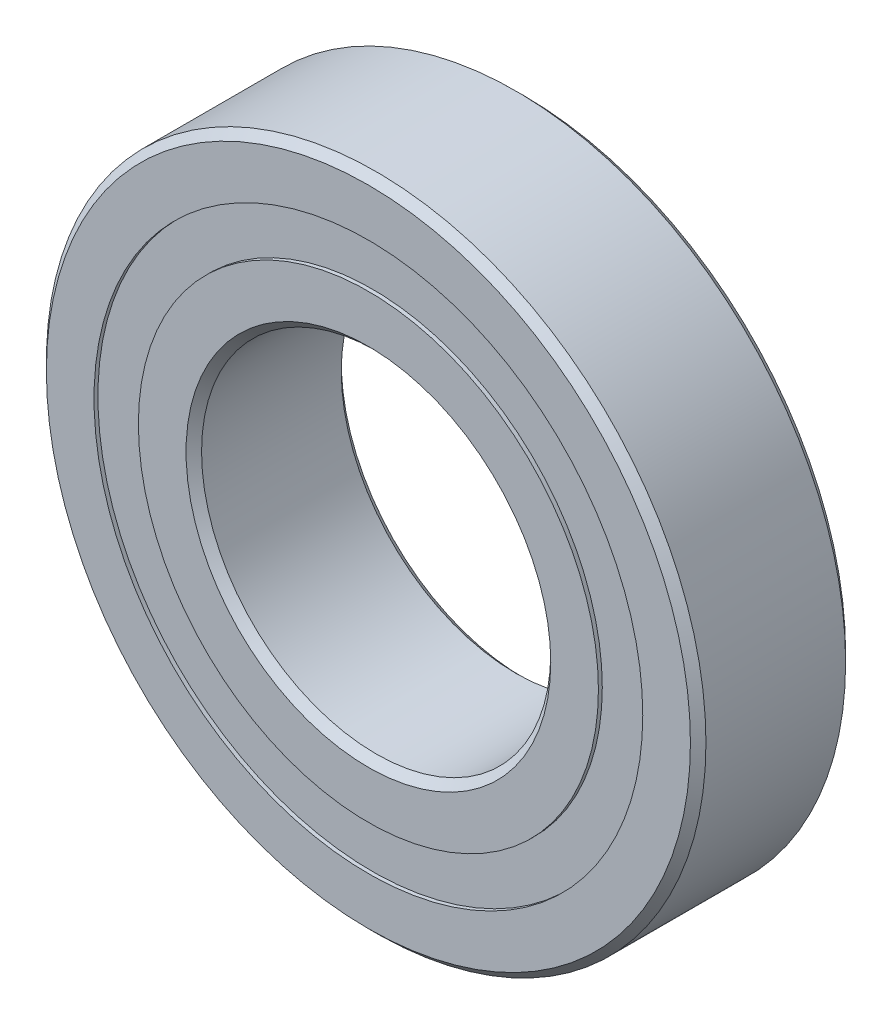
ISO-10303-21;
HEADER;
FILE_DESCRIPTION(('STEP AP214'),'2;1');
FILE_NAME('part.step','',(''),(''),'','','');
FILE_SCHEMA(('AUTOMOTIVE_DESIGN { 1 0 10303 214 1 1 1 1 }'));
ENDSEC;
DATA;
#1=APPLICATION_CONTEXT('core data for automotive mechanical design processes');
#2=APPLICATION_PROTOCOL_DEFINITION('international standard','automotive_design',2000,#1);
#3=PRODUCT_CONTEXT('',#1,'mechanical');
#4=PRODUCT('Part','Part','',(#3));
#5=PRODUCT_RELATED_PRODUCT_CATEGORY('part','',(#4));
#6=PRODUCT_DEFINITION_FORMATION('','',#4);
#7=PRODUCT_DEFINITION_CONTEXT('part definition',#1,'design');
#8=PRODUCT_DEFINITION('design','',#6,#7);
#9=PRODUCT_DEFINITION_SHAPE('','',#8);
#10=(LENGTH_UNIT() NAMED_UNIT(*) SI_UNIT(.MILLI.,.METRE.));
#11=(NAMED_UNIT(*) PLANE_ANGLE_UNIT() SI_UNIT($,.RADIAN.));
#12=(NAMED_UNIT(*) SI_UNIT($,.STERADIAN.) SOLID_ANGLE_UNIT());
#13=UNCERTAINTY_MEASURE_WITH_UNIT(LENGTH_MEASURE(1.E-05),#10,'distance_accuracy_value','');
#14=(GEOMETRIC_REPRESENTATION_CONTEXT(3) GLOBAL_UNCERTAINTY_ASSIGNED_CONTEXT((#13)) GLOBAL_UNIT_ASSIGNED_CONTEXT((#10,
#11,#12)) REPRESENTATION_CONTEXT('',''));
#15=CARTESIAN_POINT('',(0.,0.,0.));
#16=DIRECTION('',(0.,0.,1.));
#17=DIRECTION('',(1.,0.,0.));
#18=AXIS2_PLACEMENT_3D('',#15,#16,#17);
#19=CARTESIAN_POINT('',(0.,22.4517857142857,-6.0325));
#20=DIRECTION('',(0.,0.,1.));
#21=DIRECTION('',(1.,0.,0.));
#22=AXIS2_PLACEMENT_3D('',#19,#20,#21);
#23=PLANE('',#22);
#24=CARTESIAN_POINT('',(0.,0.,-6.0325));
#25=DIRECTION('',(0.,0.,1.));
#26=DIRECTION('',(1.,0.,0.));
#27=AXIS2_PLACEMENT_3D('',#24,#25,#26);
#28=CIRCLE('',#27,22.4517857142857);
#29=CARTESIAN_POINT('',(22.4517857142857,0.,-6.0325));
#30=VERTEX_POINT('',#29);
#31=EDGE_CURVE('E57',#30,#30,#28,.T.);
#32=ORIENTED_EDGE('',*,*,#31,.F.);
#33=EDGE_LOOP('',(#32));
#34=FACE_BOUND('',#33,.T.);
#35=CARTESIAN_POINT('',(0.,0.,-6.03250000000001));
#36=DIRECTION('',(0.,0.,1.));
#37=DIRECTION('',(1.,0.,0.));
#38=AXIS2_PLACEMENT_3D('',#35,#36,#37);
#39=CIRCLE('',#38,18.8232142857143);
#40=CARTESIAN_POINT('',(18.8232142857143,0.,-6.03250000000001));
#41=VERTEX_POINT('',#40);
#42=EDGE_CURVE('E11',#41,#41,#39,.T.);
#43=ORIENTED_EDGE('',*,*,#42,.T.);
#44=EDGE_LOOP('',(#43));
#45=FACE_BOUND('',#44,.T.);
#46=ADVANCED_FACE('F43',(#34,#45),#23,.F.);
#47=CARTESIAN_POINT('',(0.,0.,6.35));
#48=DIRECTION('',(0.,0.,1.));
#49=DIRECTION('',(1.,0.,0.));
#50=AXIS2_PLACEMENT_3D('',#47,#48,#49);
#51=CYLINDRICAL_SURFACE('',#50,18.8232142857143);
#52=ORIENTED_EDGE('',*,*,#42,.F.);
#53=EDGE_LOOP('',(#52));
#54=FACE_BOUND('',#53,.T.);
#55=CARTESIAN_POINT('',(0.,0.,-3.35508135887435));
#56=DIRECTION('',(0.,0.,1.));
#57=DIRECTION('',(1.,0.,0.));
#58=AXIS2_PLACEMENT_3D('',#55,#56,#57);
#59=CIRCLE('',#58,18.8232142857143);
#60=CARTESIAN_POINT('',(18.8232142857143,0.,-3.35508135887435));
#61=VERTEX_POINT('',#60);
#62=EDGE_CURVE('E49',#61,#61,#59,.T.);
#63=ORIENTED_EDGE('',*,*,#62,.T.);
#64=EDGE_LOOP('',(#63));
#65=FACE_BOUND('',#64,.T.);
#66=ADVANCED_FACE('F66',(#54,#65),#51,.F.);
#67=CARTESIAN_POINT('',(0.,22.4517857142857,-3.35508135887435));
#68=DIRECTION('',(0.,0.,-1.));
#69=DIRECTION('',(-1.,0.,0.));
#70=AXIS2_PLACEMENT_3D('',#67,#68,#69);
#71=PLANE('',#70);
#72=ORIENTED_EDGE('',*,*,#62,.F.);
#73=EDGE_LOOP('',(#72));
#74=FACE_BOUND('',#73,.T.);
#75=CARTESIAN_POINT('',(0.,0.,-3.35508135887435));
#76=DIRECTION('',(0.,0.,1.));
#77=DIRECTION('',(1.,0.,0.));
#78=AXIS2_PLACEMENT_3D('',#75,#76,#77);
#79=CIRCLE('',#78,22.4517857142857);
#80=CARTESIAN_POINT('',(22.4517857142857,0.,-3.35508135887435));
#81=VERTEX_POINT('',#80);
#82=EDGE_CURVE('E53',#81,#81,#79,.T.);
#83=ORIENTED_EDGE('',*,*,#82,.T.);
#84=EDGE_LOOP('',(#83));
#85=FACE_BOUND('',#84,.T.);
#86=ADVANCED_FACE('F70',(#74,#85),#71,.F.);
#87=CARTESIAN_POINT('',(0.,0.,6.35));
#88=DIRECTION('',(0.,0.,1.));
#89=DIRECTION('',(1.,0.,0.));
#90=AXIS2_PLACEMENT_3D('',#87,#88,#89);
#91=CYLINDRICAL_SURFACE('',#90,22.4517857142857);
#92=ORIENTED_EDGE('',*,*,#82,.F.);
#93=EDGE_LOOP('',(#92));
#94=FACE_BOUND('',#93,.T.);
#95=ORIENTED_EDGE('',*,*,#31,.T.);
#96=EDGE_LOOP('',(#95));
#97=FACE_BOUND('',#96,.T.);
#98=ADVANCED_FACE('F63',(#94,#97),#91,.T.);
#99=CLOSED_SHELL('',(#46,#66,#86,#98));
#100=MANIFOLD_SOLID_BREP('B2',#99);
#101=CARTESIAN_POINT('',(0.,22.4517857142857,6.0325));
#102=DIRECTION('',(0.,0.,-1.));
#103=DIRECTION('',(-1.,0.,0.));
#104=AXIS2_PLACEMENT_3D('',#101,#102,#103);
#105=PLANE('',#104);
#106=CARTESIAN_POINT('',(0.,0.,6.0325));
#107=DIRECTION('',(0.,0.,1.));
#108=DIRECTION('',(1.,0.,0.));
#109=AXIS2_PLACEMENT_3D('',#106,#107,#108);
#110=CIRCLE('',#109,18.8232142857143);
#111=CARTESIAN_POINT('',(18.8232142857143,0.,6.0325));
#112=VERTEX_POINT('',#111);
#113=EDGE_CURVE('E42',#112,#112,#110,.T.);
#114=ORIENTED_EDGE('',*,*,#113,.F.);
#115=EDGE_LOOP('',(#114));
#116=FACE_BOUND('',#115,.T.);
#117=CARTESIAN_POINT('',(0.,0.,6.0325));
#118=DIRECTION('',(0.,0.,1.));
#119=DIRECTION('',(1.,0.,0.));
#120=AXIS2_PLACEMENT_3D('',#117,#118,#119);
#121=CIRCLE('',#120,22.4517857142857);
#122=CARTESIAN_POINT('',(22.4517857142857,0.,6.0325));
#123=VERTEX_POINT('',#122);
#124=EDGE_CURVE('E124',#123,#123,#121,.T.);
#125=ORIENTED_EDGE('',*,*,#124,.T.);
#126=EDGE_LOOP('',(#125));
#127=FACE_BOUND('',#126,.T.);
#128=ADVANCED_FACE('F110',(#116,#127),#105,.F.);
#129=CARTESIAN_POINT('',(0.,0.,6.35));
#130=DIRECTION('',(0.,0.,1.));
#131=DIRECTION('',(1.,0.,0.));
#132=AXIS2_PLACEMENT_3D('',#129,#130,#131);
#133=CYLINDRICAL_SURFACE('',#132,18.8232142857143);
#134=CARTESIAN_POINT('',(0.,0.,3.35508135887435));
#135=DIRECTION('',(0.,0.,1.));
#136=DIRECTION('',(1.,0.,0.));
#137=AXIS2_PLACEMENT_3D('',#134,#135,#136);
#138=CIRCLE('',#137,18.8232142857143);
#139=CARTESIAN_POINT('',(18.8232142857143,0.,3.35508135887435));
#140=VERTEX_POINT('',#139);
#141=EDGE_CURVE('E116',#140,#140,#138,.T.);
#142=ORIENTED_EDGE('',*,*,#141,.F.);
#143=EDGE_LOOP('',(#142));
#144=FACE_BOUND('',#143,.T.);
#145=ORIENTED_EDGE('',*,*,#113,.T.);
#146=EDGE_LOOP('',(#145));
#147=FACE_BOUND('',#146,.T.);
#148=ADVANCED_FACE('F139',(#144,#147),#133,.F.);
#149=CARTESIAN_POINT('',(0.,22.4517857142857,3.35508135887435));
#150=DIRECTION('',(0.,0.,1.));
#151=DIRECTION('',(1.,0.,0.));
#152=AXIS2_PLACEMENT_3D('',#149,#150,#151);
#153=PLANE('',#152);
#154=CARTESIAN_POINT('',(0.,0.,3.35508135887435));
#155=DIRECTION('',(0.,0.,1.));
#156=DIRECTION('',(1.,0.,0.));
#157=AXIS2_PLACEMENT_3D('',#154,#155,#156);
#158=CIRCLE('',#157,22.4517857142857);
#159=CARTESIAN_POINT('',(22.4517857142857,0.,3.35508135887435));
#160=VERTEX_POINT('',#159);
#161=EDGE_CURVE('E120',#160,#160,#158,.T.);
#162=ORIENTED_EDGE('',*,*,#161,.F.);
#163=EDGE_LOOP('',(#162));
#164=FACE_BOUND('',#163,.T.);
#165=ORIENTED_EDGE('',*,*,#141,.T.);
#166=EDGE_LOOP('',(#165));
#167=FACE_BOUND('',#166,.T.);
#168=ADVANCED_FACE('F134',(#164,#167),#153,.F.);
#169=CARTESIAN_POINT('',(0.,0.,6.35));
#170=DIRECTION('',(0.,0.,1.));
#171=DIRECTION('',(1.,0.,0.));
#172=AXIS2_PLACEMENT_3D('',#169,#170,#171);
#173=CYLINDRICAL_SURFACE('',#172,22.4517857142857);
#174=ORIENTED_EDGE('',*,*,#124,.F.);
#175=EDGE_LOOP('',(#174));
#176=FACE_BOUND('',#175,.T.);
#177=ORIENTED_EDGE('',*,*,#161,.T.);
#178=EDGE_LOOP('',(#177));
#179=FACE_BOUND('',#178,.T.);
#180=ADVANCED_FACE('F131',(#176,#179),#173,.T.);
#181=CLOSED_SHELL('',(#128,#148,#168,#180));
#182=MANIFOLD_SOLID_BREP('B6',#181);
#183=CARTESIAN_POINT('',(-10.3187499999998,17.8725992706015,0.));
#184=DIRECTION('',(0.,0.,1.));
#185=DIRECTION('',(-0.499999999999989,0.866025403784445,0.));
#186=AXIS2_PLACEMENT_3D('',#183,#184,#185);
#187=SPHERICAL_SURFACE('',#186,3.35508135887435);
#188=CARTESIAN_POINT('',(-10.3187499999998,17.8725992706015,3.35508135887435));
#189=VERTEX_POINT('',#188);
#190=VERTEX_LOOP('',#189);
#191=FACE_BOUND('',#190,.T.);
#192=ADVANCED_FACE('F177',(#191),#187,.T.);
#193=CLOSED_SHELL('',(#192));
#194=MANIFOLD_SOLID_BREP('B37',#193);
#195=CARTESIAN_POINT('',(-17.8725992706012,10.3187500000002,0.));
#196=DIRECTION('',(0.,0.,1.));
#197=DIRECTION('',(-0.866025403784433,0.50000000000001,0.));
#198=AXIS2_PLACEMENT_3D('',#195,#196,#197);
#199=SPHERICAL_SURFACE('',#198,3.35508135887435);
#200=CARTESIAN_POINT('',(-17.8725992706012,10.3187500000002,3.35508135887435));
#201=VERTEX_POINT('',#200);
#202=VERTEX_LOOP('',#201);
#203=FACE_BOUND('',#202,.T.);
#204=ADVANCED_FACE('F197',(#203),#199,.T.);
#205=CLOSED_SHELL('',(#204));
#206=MANIFOLD_SOLID_BREP('B106',#205);
#207=CARTESIAN_POINT('',(-20.6375,2.16166338391125E-13,0.));
#208=DIRECTION('',(0.,0.,1.));
#209=DIRECTION('',(-1.,0.,0.));
#210=AXIS2_PLACEMENT_3D('',#207,#208,#209);
#211=SPHERICAL_SURFACE('',#210,3.35508135887435);
#212=CARTESIAN_POINT('',(-20.6375,2.16166338391125E-13,3.35508135887435));
#213=VERTEX_POINT('',#212);
#214=VERTEX_LOOP('',#213);
#215=FACE_BOUND('',#214,.T.);
#216=ADVANCED_FACE('F217',(#215),#211,.T.);
#217=CLOSED_SHELL('',(#216));
#218=MANIFOLD_SOLID_BREP('B173',#217);
#219=CARTESIAN_POINT('',(-17.8725992706014,-10.3187499999998,0.));
#220=DIRECTION('',(0.,0.,1.));
#221=DIRECTION('',(-0.866025403784443,-0.499999999999992,0.));
#222=AXIS2_PLACEMENT_3D('',#219,#220,#221);
#223=SPHERICAL_SURFACE('',#222,3.35508135887435);
#224=CARTESIAN_POINT('',(-17.8725992706014,-10.3187499999998,3.35508135887435));
#225=VERTEX_POINT('',#224);
#226=VERTEX_LOOP('',#225);
#227=FACE_BOUND('',#226,.T.);
#228=ADVANCED_FACE('F237',(#227),#223,.T.);
#229=CLOSED_SHELL('',(#228));
#230=MANIFOLD_SOLID_BREP('B193',#229);
#231=CARTESIAN_POINT('',(-10.3187500000001,-17.8725992706013,0.));
#232=DIRECTION('',(0.,0.,1.));
#233=DIRECTION('',(-0.500000000000007,-0.866025403784435,0.));
#234=AXIS2_PLACEMENT_3D('',#231,#232,#233);
#235=SPHERICAL_SURFACE('',#234,3.35508135887435);
#236=CARTESIAN_POINT('',(-10.3187500000001,-17.8725992706013,3.35508135887435));
#237=VERTEX_POINT('',#236);
#238=VERTEX_LOOP('',#237);
#239=FACE_BOUND('',#238,.T.);
#240=ADVANCED_FACE('F257',(#239),#235,.T.);
#241=CLOSED_SHELL('',(#240));
#242=MANIFOLD_SOLID_BREP('B213',#241);
#243=CARTESIAN_POINT('',(-1.4411089226075E-13,-20.6375,0.));
#244=DIRECTION('',(0.,0.,1.));
#245=DIRECTION('',(0.,-1.,0.));
#246=AXIS2_PLACEMENT_3D('',#243,#244,#245);
#247=SPHERICAL_SURFACE('',#246,3.35508135887435);
#248=CARTESIAN_POINT('',(-1.4411089226075E-13,-20.6375,3.35508135887435));
#249=VERTEX_POINT('',#248);
#250=VERTEX_LOOP('',#249);
#251=FACE_BOUND('',#250,.T.);
#252=ADVANCED_FACE('F277',(#251),#247,.T.);
#253=CLOSED_SHELL('',(#252));
#254=MANIFOLD_SOLID_BREP('B233',#253);
#255=CARTESIAN_POINT('',(10.3187499999999,-17.8725992706014,0.));
#256=DIRECTION('',(0.,0.,1.));
#257=DIRECTION('',(0.499999999999995,-0.866025403784442,0.));
#258=AXIS2_PLACEMENT_3D('',#255,#256,#257);
#259=SPHERICAL_SURFACE('',#258,3.35508135887435);
#260=CARTESIAN_POINT('',(10.3187499999999,-17.8725992706014,3.35508135887435));
#261=VERTEX_POINT('',#260);
#262=VERTEX_LOOP('',#261);
#263=FACE_BOUND('',#262,.T.);
#264=ADVANCED_FACE('F297',(#263),#259,.T.);
#265=CLOSED_SHELL('',(#264));
#266=MANIFOLD_SOLID_BREP('B253',#265);
#267=CARTESIAN_POINT('',(17.8725992706013,-10.3187500000001,0.));
#268=DIRECTION('',(0.,0.,1.));
#269=DIRECTION('',(0.866025403784436,-0.500000000000004,0.));
#270=AXIS2_PLACEMENT_3D('',#267,#268,#269);
#271=SPHERICAL_SURFACE('',#270,3.35508135887435);
#272=CARTESIAN_POINT('',(17.8725992706013,-10.3187500000001,3.35508135887435));
#273=VERTEX_POINT('',#272);
#274=VERTEX_LOOP('',#273);
#275=FACE_BOUND('',#274,.T.);
#276=ADVANCED_FACE('F317',(#275),#271,.T.);
#277=CLOSED_SHELL('',(#276));
#278=MANIFOLD_SOLID_BREP('B273',#277);
#279=CARTESIAN_POINT('',(20.6375,0.,0.));
#280=DIRECTION('',(0.,0.,1.));
#281=DIRECTION('',(1.,0.,0.));
#282=AXIS2_PLACEMENT_3D('',#279,#280,#281);
#283=SPHERICAL_SURFACE('',#282,3.35508135887435);
#284=CARTESIAN_POINT('',(20.6375,0.,3.35508135887435));
#285=VERTEX_POINT('',#284);
#286=VERTEX_LOOP('',#285);
#287=FACE_BOUND('',#286,.T.);
#288=ADVANCED_FACE('F337',(#287),#283,.T.);
#289=CLOSED_SHELL('',(#288));
#290=MANIFOLD_SOLID_BREP('B293',#289);
#291=CARTESIAN_POINT('',(17.8725992706014,10.31875,0.));
#292=DIRECTION('',(0.,0.,1.));
#293=DIRECTION('',(0.86602540378444,0.499999999999998,0.));
#294=AXIS2_PLACEMENT_3D('',#291,#292,#293);
#295=SPHERICAL_SURFACE('',#294,3.35508135887435);
#296=CARTESIAN_POINT('',(17.8725992706014,10.31875,3.35508135887435));
#297=VERTEX_POINT('',#296);
#298=VERTEX_LOOP('',#297);
#299=FACE_BOUND('',#298,.T.);
#300=ADVANCED_FACE('F357',(#299),#295,.T.);
#301=CLOSED_SHELL('',(#300));
#302=MANIFOLD_SOLID_BREP('B313',#301);
#303=CARTESIAN_POINT('',(10.31875,17.8725992706013,0.));
#304=DIRECTION('',(0.,0.,1.));
#305=DIRECTION('',(0.500000000000001,0.866025403784438,0.));
#306=AXIS2_PLACEMENT_3D('',#303,#304,#305);
#307=SPHERICAL_SURFACE('',#306,3.35508135887435);
#308=CARTESIAN_POINT('',(10.31875,17.8725992706013,3.35508135887435));
#309=VERTEX_POINT('',#308);
#310=VERTEX_LOOP('',#309);
#311=FACE_BOUND('',#310,.T.);
#312=ADVANCED_FACE('F377',(#311),#307,.T.);
#313=CLOSED_SHELL('',(#312));
#314=MANIFOLD_SOLID_BREP('B333',#313);
#315=CARTESIAN_POINT('',(0.,20.6375,0.));
#316=DIRECTION('',(0.,0.,1.));
#317=DIRECTION('',(0.,1.,0.));
#318=AXIS2_PLACEMENT_3D('',#315,#316,#317);
#319=SPHERICAL_SURFACE('',#318,3.35508135887435);
#320=CARTESIAN_POINT('',(0.,20.6375,3.35508135887435));
#321=VERTEX_POINT('',#320);
#322=VERTEX_LOOP('',#321);
#323=FACE_BOUND('',#322,.T.);
#324=ADVANCED_FACE('F399',(#323),#319,.T.);
#325=CLOSED_SHELL('',(#324));
#326=MANIFOLD_SOLID_BREP('B353',#325);
#327=CARTESIAN_POINT('',(0.,18.8232142857143,6.35));
#328=DIRECTION('',(0.,0.,-1.));
#329=DIRECTION('',(-1.,0.,0.));
#330=AXIS2_PLACEMENT_3D('',#327,#328,#329);
#331=PLANE('',#330);
#332=CARTESIAN_POINT('',(0.,0.,6.35));
#333=DIRECTION('',(0.,0.,1.));
#334=DIRECTION('',(1.,0.,0.));
#335=AXIS2_PLACEMENT_3D('',#332,#333,#334);
#336=CIRCLE('',#335,14.9225);
#337=CARTESIAN_POINT('',(14.9225,0.,6.35));
#338=VERTEX_POINT('',#337);
#339=EDGE_CURVE('E446',#338,#338,#336,.T.);
#340=ORIENTED_EDGE('',*,*,#339,.F.);
#341=EDGE_LOOP('',(#340));
#342=FACE_BOUND('',#341,.T.);
#343=CARTESIAN_POINT('',(0.,0.,6.35));
#344=DIRECTION('',(0.,0.,1.));
#345=DIRECTION('',(1.,0.,0.));
#346=AXIS2_PLACEMENT_3D('',#343,#344,#345);
#347=CIRCLE('',#346,18.8232142857143);
#348=CARTESIAN_POINT('',(18.8232142857143,0.,6.35));
#349=VERTEX_POINT('',#348);
#350=EDGE_CURVE('E398',#349,#349,#347,.T.);
#351=ORIENTED_EDGE('',*,*,#350,.T.);
#352=EDGE_LOOP('',(#351));
#353=FACE_BOUND('',#352,.T.);
#354=ADVANCED_FACE('F418',(#342,#353),#331,.F.);
#355=CARTESIAN_POINT('',(0.,0.,6.35));
#356=DIRECTION('',(0.,0.,1.));
#357=DIRECTION('',(1.,0.,0.));
#358=AXIS2_PLACEMENT_3D('',#355,#356,#357);
#359=CYLINDRICAL_SURFACE('',#358,18.8232142857143);
#360=ORIENTED_EDGE('',*,*,#350,.F.);
#361=EDGE_LOOP('',(#360));
#362=FACE_BOUND('',#361,.T.);
#363=CARTESIAN_POINT('',(0.,0.,2.82222222222222));
#364=DIRECTION('',(0.,0.,1.));
#365=DIRECTION('',(1.,0.,0.));
#366=AXIS2_PLACEMENT_3D('',#363,#364,#365);
#367=CIRCLE('',#366,18.8232142857143);
#368=CARTESIAN_POINT('',(18.8232142857143,0.,2.82222222222222));
#369=VERTEX_POINT('',#368);
#370=EDGE_CURVE('E424',#369,#369,#367,.T.);
#371=ORIENTED_EDGE('',*,*,#370,.T.);
#372=EDGE_LOOP('',(#371));
#373=FACE_BOUND('',#372,.T.);
#374=ADVANCED_FACE('F453',(#362,#373),#359,.T.);
#375=CARTESIAN_POINT('',(0.,0.,0.));
#376=DIRECTION('',(0.,0.,1.));
#377=DIRECTION('',(1.,0.,0.));
#378=AXIS2_PLACEMENT_3D('',#375,#376,#377);
#379=TOROIDAL_SURFACE('',#378,20.6375,3.35508135887435);
#380=ORIENTED_EDGE('',*,*,#370,.F.);
#381=EDGE_LOOP('',(#380));
#382=FACE_BOUND('',#381,.T.);
#383=CARTESIAN_POINT('',(0.,0.,-2.82222222222223));
#384=DIRECTION('',(0.,0.,1.));
#385=DIRECTION('',(1.,0.,0.));
#386=AXIS2_PLACEMENT_3D('',#383,#384,#385);
#387=CIRCLE('',#386,18.8232142857143);
#388=CARTESIAN_POINT('',(18.8232142857143,0.,-2.82222222222223));
#389=VERTEX_POINT('',#388);
#390=EDGE_CURVE('E428',#389,#389,#387,.T.);
#391=ORIENTED_EDGE('',*,*,#390,.T.);
#392=EDGE_LOOP('',(#391));
#393=FACE_BOUND('',#392,.T.);
#394=ADVANCED_FACE('F457',(#382,#393),#379,.F.);
#395=CARTESIAN_POINT('',(0.,0.,6.35));
#396=DIRECTION('',(0.,0.,1.));
#397=DIRECTION('',(1.,0.,0.));
#398=AXIS2_PLACEMENT_3D('',#395,#396,#397);
#399=CYLINDRICAL_SURFACE('',#398,18.8232142857143);
#400=ORIENTED_EDGE('',*,*,#390,.F.);
#401=EDGE_LOOP('',(#400));
#402=FACE_BOUND('',#401,.T.);
#403=CARTESIAN_POINT('',(0.,0.,-6.35));
#404=DIRECTION('',(0.,0.,1.));
#405=DIRECTION('',(1.,0.,0.));
#406=AXIS2_PLACEMENT_3D('',#403,#404,#405);
#407=CIRCLE('',#406,18.8232142857143);
#408=CARTESIAN_POINT('',(18.8232142857143,0.,-6.35));
#409=VERTEX_POINT('',#408);
#410=EDGE_CURVE('E432',#409,#409,#407,.T.);
#411=ORIENTED_EDGE('',*,*,#410,.T.);
#412=EDGE_LOOP('',(#411));
#413=FACE_BOUND('',#412,.T.);
#414=ADVANCED_FACE('F462',(#402,#413),#399,.T.);
#415=CARTESIAN_POINT('',(0.,14.9225,-6.35));
#416=DIRECTION('',(0.,0.,1.));
#417=DIRECTION('',(1.,0.,0.));
#418=AXIS2_PLACEMENT_3D('',#415,#416,#417);
#419=PLANE('',#418);
#420=ORIENTED_EDGE('',*,*,#410,.F.);
#421=EDGE_LOOP('',(#420));
#422=FACE_BOUND('',#421,.T.);
#423=CARTESIAN_POINT('',(0.,0.,-6.35));
#424=DIRECTION('',(0.,0.,1.));
#425=DIRECTION('',(1.,0.,0.));
#426=AXIS2_PLACEMENT_3D('',#423,#424,#425);
#427=CIRCLE('',#426,14.9225);
#428=CARTESIAN_POINT('',(14.9225,0.,-6.35));
#429=VERTEX_POINT('',#428);
#430=EDGE_CURVE('E437',#429,#429,#427,.T.);
#431=ORIENTED_EDGE('',*,*,#430,.T.);
#432=EDGE_LOOP('',(#431));
#433=FACE_BOUND('',#432,.T.);
#434=ADVANCED_FACE('F468',(#422,#433),#419,.F.);
#435=CARTESIAN_POINT('',(0.,0.,-5.715));
#436=DIRECTION('',(0.,0.,-1.));
#437=DIRECTION('',(-1.,0.,0.));
#438=AXIS2_PLACEMENT_3D('',#435,#436,#437);
#439=CONICAL_SURFACE('',#438,14.2875,0.785398163397448);
#440=ORIENTED_EDGE('',*,*,#430,.F.);
#441=EDGE_LOOP('',(#440));
#442=FACE_BOUND('',#441,.T.);
#443=CARTESIAN_POINT('',(0.,0.,-5.715));
#444=DIRECTION('',(0.,0.,1.));
#445=DIRECTION('',(1.,0.,0.));
#446=AXIS2_PLACEMENT_3D('',#443,#444,#445);
#447=CIRCLE('',#446,14.2875);
#448=CARTESIAN_POINT('',(14.2875,0.,-5.715));
#449=VERTEX_POINT('',#448);
#450=EDGE_CURVE('E440',#449,#449,#447,.T.);
#451=ORIENTED_EDGE('',*,*,#450,.T.);
#452=EDGE_LOOP('',(#451));
#453=FACE_BOUND('',#452,.T.);
#454=ADVANCED_FACE('F472',(#442,#453),#439,.F.);
#455=CARTESIAN_POINT('',(0.,0.,6.35));
#456=DIRECTION('',(0.,0.,1.));
#457=DIRECTION('',(1.,0.,0.));
#458=AXIS2_PLACEMENT_3D('',#455,#456,#457);
#459=CYLINDRICAL_SURFACE('',#458,14.2875);
#460=ORIENTED_EDGE('',*,*,#450,.F.);
#461=EDGE_LOOP('',(#460));
#462=FACE_BOUND('',#461,.T.);
#463=CARTESIAN_POINT('',(0.,0.,5.71500000000001));
#464=DIRECTION('',(0.,0.,1.));
#465=DIRECTION('',(1.,0.,0.));
#466=AXIS2_PLACEMENT_3D('',#463,#464,#465);
#467=CIRCLE('',#466,14.2875);
#468=CARTESIAN_POINT('',(14.2875,0.,5.71500000000001));
#469=VERTEX_POINT('',#468);
#470=EDGE_CURVE('E443',#469,#469,#467,.T.);
#471=ORIENTED_EDGE('',*,*,#470,.T.);
#472=EDGE_LOOP('',(#471));
#473=FACE_BOUND('',#472,.T.);
#474=ADVANCED_FACE('F476',(#462,#473),#459,.F.);
#475=CARTESIAN_POINT('',(0.,0.,6.35));
#476=DIRECTION('',(0.,0.,1.));
#477=DIRECTION('',(1.,0.,0.));
#478=AXIS2_PLACEMENT_3D('',#475,#476,#477);
#479=CONICAL_SURFACE('',#478,14.9225,0.785398163397452);
#480=ORIENTED_EDGE('',*,*,#470,.F.);
#481=EDGE_LOOP('',(#480));
#482=FACE_BOUND('',#481,.T.);
#483=ORIENTED_EDGE('',*,*,#339,.T.);
#484=EDGE_LOOP('',(#483));
#485=FACE_BOUND('',#484,.T.);
#486=ADVANCED_FACE('F450',(#482,#485),#479,.F.);
#487=CLOSED_SHELL('',(#354,#374,#394,#414,#434,#454,#474,#486));
#488=MANIFOLD_SOLID_BREP('B373',#487);
#489=CARTESIAN_POINT('',(0.,0.,5.715));
#490=DIRECTION('',(0.,0.,-1.));
#491=DIRECTION('',(-1.,0.,0.));
#492=AXIS2_PLACEMENT_3D('',#489,#490,#491);
#493=CONICAL_SURFACE('',#492,26.9875,0.785398163397448);
#494=CARTESIAN_POINT('',(0.,0.,6.35));
#495=DIRECTION('',(0.,0.,1.));
#496=DIRECTION('',(1.,0.,0.));
#497=AXIS2_PLACEMENT_3D('',#494,#495,#496);
#498=CIRCLE('',#497,26.3525);
#499=CARTESIAN_POINT('',(26.3525,0.,6.35));
#500=VERTEX_POINT('',#499);
#501=EDGE_CURVE('E567',#500,#500,#498,.T.);
#502=ORIENTED_EDGE('',*,*,#501,.F.);
#503=EDGE_LOOP('',(#502));
#504=FACE_BOUND('',#503,.T.);
#505=CARTESIAN_POINT('',(0.,0.,5.715));
#506=DIRECTION('',(0.,0.,1.));
#507=DIRECTION('',(1.,0.,0.));
#508=AXIS2_PLACEMENT_3D('',#505,#506,#507);
#509=CIRCLE('',#508,26.9875);
#510=CARTESIAN_POINT('',(26.9875,0.,5.715));
#511=VERTEX_POINT('',#510);
#512=EDGE_CURVE('E417',#511,#511,#509,.T.);
#513=ORIENTED_EDGE('',*,*,#512,.T.);
#514=EDGE_LOOP('',(#513));
#515=FACE_BOUND('',#514,.T.);
#516=ADVANCED_FACE('F539',(#504,#515),#493,.T.);
#517=CARTESIAN_POINT('',(0.,0.,6.35));
#518=DIRECTION('',(0.,0.,1.));
#519=DIRECTION('',(1.,0.,0.));
#520=AXIS2_PLACEMENT_3D('',#517,#518,#519);
#521=CYLINDRICAL_SURFACE('',#520,26.9875);
#522=ORIENTED_EDGE('',*,*,#512,.F.);
#523=EDGE_LOOP('',(#522));
#524=FACE_BOUND('',#523,.T.);
#525=CARTESIAN_POINT('',(0.,0.,-5.715));
#526=DIRECTION('',(0.,0.,1.));
#527=DIRECTION('',(1.,0.,0.));
#528=AXIS2_PLACEMENT_3D('',#525,#526,#527);
#529=CIRCLE('',#528,26.9875);
#530=CARTESIAN_POINT('',(26.9875,0.,-5.715));
#531=VERTEX_POINT('',#530);
#532=EDGE_CURVE('E545',#531,#531,#529,.T.);
#533=ORIENTED_EDGE('',*,*,#532,.T.);
#534=EDGE_LOOP('',(#533));
#535=FACE_BOUND('',#534,.T.);
#536=ADVANCED_FACE('F574',(#524,#535),#521,.T.);
#537=CARTESIAN_POINT('',(0.,0.,-6.35));
#538=DIRECTION('',(0.,0.,1.));
#539=DIRECTION('',(1.,0.,0.));
#540=AXIS2_PLACEMENT_3D('',#537,#538,#539);
#541=CONICAL_SURFACE('',#540,26.3525,0.785398163397448);
#542=ORIENTED_EDGE('',*,*,#532,.F.);
#543=EDGE_LOOP('',(#542));
#544=FACE_BOUND('',#543,.T.);
#545=CARTESIAN_POINT('',(0.,0.,-6.35));
#546=DIRECTION('',(0.,0.,1.));
#547=DIRECTION('',(1.,0.,0.));
#548=AXIS2_PLACEMENT_3D('',#545,#546,#547);
#549=CIRCLE('',#548,26.3525);
#550=CARTESIAN_POINT('',(26.3525,0.,-6.35));
#551=VERTEX_POINT('',#550);
#552=EDGE_CURVE('E549',#551,#551,#549,.T.);
#553=ORIENTED_EDGE('',*,*,#552,.T.);
#554=EDGE_LOOP('',(#553));
#555=FACE_BOUND('',#554,.T.);
#556=ADVANCED_FACE('F578',(#544,#555),#541,.T.);
#557=CARTESIAN_POINT('',(0.,26.3525,-6.35));
#558=DIRECTION('',(0.,0.,1.));
#559=DIRECTION('',(1.,0.,0.));
#560=AXIS2_PLACEMENT_3D('',#557,#558,#559);
#561=PLANE('',#560);
#562=ORIENTED_EDGE('',*,*,#552,.F.);
#563=EDGE_LOOP('',(#562));
#564=FACE_BOUND('',#563,.T.);
#565=CARTESIAN_POINT('',(0.,0.,-6.35));
#566=DIRECTION('',(0.,0.,1.));
#567=DIRECTION('',(1.,0.,0.));
#568=AXIS2_PLACEMENT_3D('',#565,#566,#567);
#569=CIRCLE('',#568,22.4517857142857);
#570=CARTESIAN_POINT('',(22.4517857142857,0.,-6.35));
#571=VERTEX_POINT('',#570);
#572=EDGE_CURVE('E553',#571,#571,#569,.T.);
#573=ORIENTED_EDGE('',*,*,#572,.T.);
#574=EDGE_LOOP('',(#573));
#575=FACE_BOUND('',#574,.T.);
#576=ADVANCED_FACE('F583',(#564,#575),#561,.F.);
#577=CARTESIAN_POINT('',(0.,0.,6.35));
#578=DIRECTION('',(0.,0.,1.));
#579=DIRECTION('',(1.,0.,0.));
#580=AXIS2_PLACEMENT_3D('',#577,#578,#579);
#581=CYLINDRICAL_SURFACE('',#580,22.4517857142857);
#582=ORIENTED_EDGE('',*,*,#572,.F.);
#583=EDGE_LOOP('',(#582));
#584=FACE_BOUND('',#583,.T.);
#585=CARTESIAN_POINT('',(0.,0.,-2.82222222222222));
#586=DIRECTION('',(0.,0.,1.));
#587=DIRECTION('',(1.,0.,0.));
#588=AXIS2_PLACEMENT_3D('',#585,#586,#587);
#589=CIRCLE('',#588,22.4517857142857);
#590=CARTESIAN_POINT('',(22.4517857142857,0.,-2.82222222222222));
#591=VERTEX_POINT('',#590);
#592=EDGE_CURVE('E558',#591,#591,#589,.T.);
#593=ORIENTED_EDGE('',*,*,#592,.T.);
#594=EDGE_LOOP('',(#593));
#595=FACE_BOUND('',#594,.T.);
#596=ADVANCED_FACE('F589',(#584,#595),#581,.F.);
#597=CARTESIAN_POINT('',(0.,0.,0.));
#598=DIRECTION('',(0.,0.,1.));
#599=DIRECTION('',(1.,0.,0.));
#600=AXIS2_PLACEMENT_3D('',#597,#598,#599);
#601=TOROIDAL_SURFACE('',#600,20.6375,3.35508135887435);
#602=ORIENTED_EDGE('',*,*,#592,.F.);
#603=EDGE_LOOP('',(#602));
#604=FACE_BOUND('',#603,.T.);
#605=CARTESIAN_POINT('',(0.,0.,2.82222222222222));
#606=DIRECTION('',(0.,0.,1.));
#607=DIRECTION('',(1.,0.,0.));
#608=AXIS2_PLACEMENT_3D('',#605,#606,#607);
#609=CIRCLE('',#608,22.4517857142857);
#610=CARTESIAN_POINT('',(22.4517857142857,0.,2.82222222222222));
#611=VERTEX_POINT('',#610);
#612=EDGE_CURVE('E561',#611,#611,#609,.T.);
#613=ORIENTED_EDGE('',*,*,#612,.T.);
#614=EDGE_LOOP('',(#613));
#615=FACE_BOUND('',#614,.T.);
#616=ADVANCED_FACE('F593',(#604,#615),#601,.F.);
#617=CARTESIAN_POINT('',(0.,0.,6.35));
#618=DIRECTION('',(0.,0.,1.));
#619=DIRECTION('',(1.,0.,0.));
#620=AXIS2_PLACEMENT_3D('',#617,#618,#619);
#621=CYLINDRICAL_SURFACE('',#620,22.4517857142857);
#622=ORIENTED_EDGE('',*,*,#612,.F.);
#623=EDGE_LOOP('',(#622));
#624=FACE_BOUND('',#623,.T.);
#625=CARTESIAN_POINT('',(0.,0.,6.35));
#626=DIRECTION('',(0.,0.,1.));
#627=DIRECTION('',(1.,0.,0.));
#628=AXIS2_PLACEMENT_3D('',#625,#626,#627);
#629=CIRCLE('',#628,22.4517857142857);
#630=CARTESIAN_POINT('',(22.4517857142857,0.,6.35));
#631=VERTEX_POINT('',#630);
#632=EDGE_CURVE('E564',#631,#631,#629,.T.);
#633=ORIENTED_EDGE('',*,*,#632,.T.);
#634=EDGE_LOOP('',(#633));
#635=FACE_BOUND('',#634,.T.);
#636=ADVANCED_FACE('F597',(#624,#635),#621,.F.);
#637=CARTESIAN_POINT('',(0.,26.3525,6.35));
#638=DIRECTION('',(0.,0.,-1.));
#639=DIRECTION('',(-1.,0.,0.));
#640=AXIS2_PLACEMENT_3D('',#637,#638,#639);
#641=PLANE('',#640);
#642=ORIENTED_EDGE('',*,*,#632,.F.);
#643=EDGE_LOOP('',(#642));
#644=FACE_BOUND('',#643,.T.);
#645=ORIENTED_EDGE('',*,*,#501,.T.);
#646=EDGE_LOOP('',(#645));
#647=FACE_BOUND('',#646,.T.);
#648=ADVANCED_FACE('F571',(#644,#647),#641,.F.);
#649=CLOSED_SHELL('',(#516,#536,#556,#576,#596,#616,#636,#648));
#650=MANIFOLD_SOLID_BREP('B393',#649);
#651=ADVANCED_BREP_SHAPE_REPRESENTATION('',(#18,#100,#182,#194,#206,#218,#230,#242,#254,#266,
#278,#290,#302,#314,#326,#488,#650),#14);
#652=SHAPE_DEFINITION_REPRESENTATION(#9,#651);
ENDSEC;
END-ISO-10303-21;
